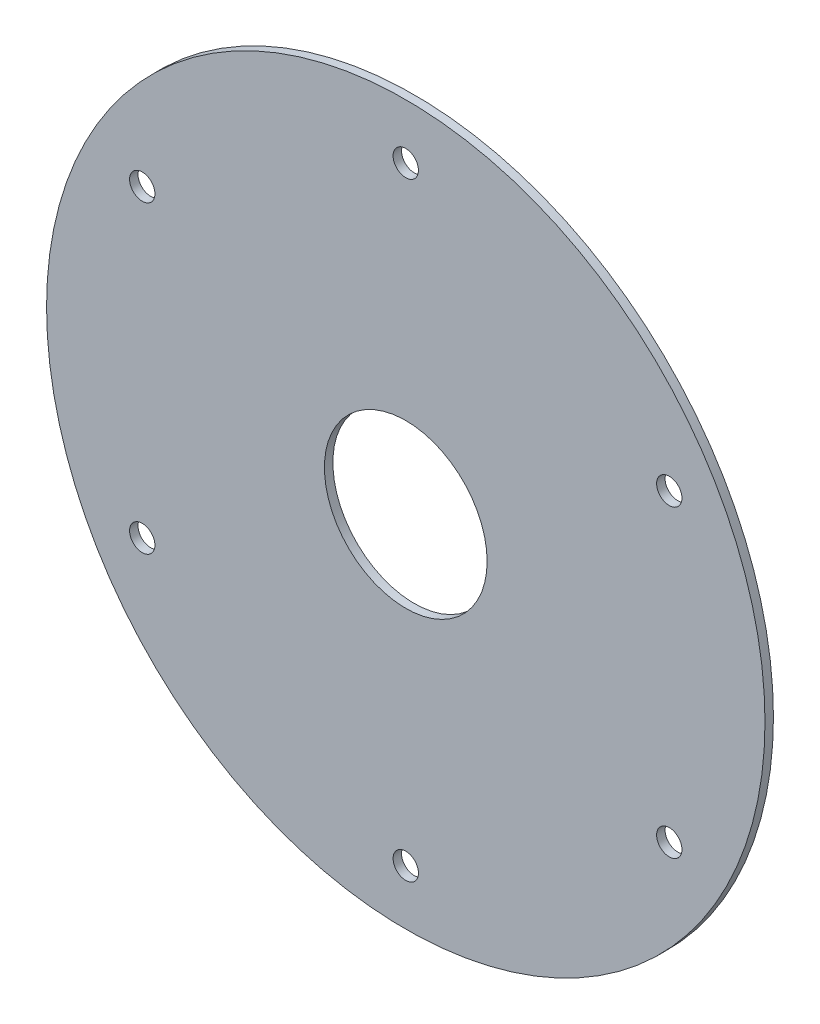
ISO-10303-21;
HEADER;
FILE_DESCRIPTION(('STEP AP214'),'2;1');
FILE_NAME('part.step','',(''),(''),'','','');
FILE_SCHEMA(('AUTOMOTIVE_DESIGN { 1 0 10303 214 1 1 1 1 }'));
ENDSEC;
DATA;
#1=APPLICATION_CONTEXT('core data for automotive mechanical design processes');
#2=APPLICATION_PROTOCOL_DEFINITION('international standard','automotive_design',2000,#1);
#3=PRODUCT_CONTEXT('',#1,'mechanical');
#4=PRODUCT('Part','Part','',(#3));
#5=PRODUCT_RELATED_PRODUCT_CATEGORY('part','',(#4));
#6=PRODUCT_DEFINITION_FORMATION('','',#4);
#7=PRODUCT_DEFINITION_CONTEXT('part definition',#1,'design');
#8=PRODUCT_DEFINITION('design','',#6,#7);
#9=PRODUCT_DEFINITION_SHAPE('','',#8);
#10=(LENGTH_UNIT() NAMED_UNIT(*) SI_UNIT(.MILLI.,.METRE.));
#11=(NAMED_UNIT(*) PLANE_ANGLE_UNIT() SI_UNIT($,.RADIAN.));
#12=(NAMED_UNIT(*) SI_UNIT($,.STERADIAN.) SOLID_ANGLE_UNIT());
#13=UNCERTAINTY_MEASURE_WITH_UNIT(LENGTH_MEASURE(1.E-05),#10,'distance_accuracy_value','');
#14=(GEOMETRIC_REPRESENTATION_CONTEXT(3) GLOBAL_UNCERTAINTY_ASSIGNED_CONTEXT((#13)) GLOBAL_UNIT_ASSIGNED_CONTEXT((#10,
#11,#12)) REPRESENTATION_CONTEXT('',''));
#15=CARTESIAN_POINT('',(0.,0.,0.));
#16=DIRECTION('',(0.,0.,1.));
#17=DIRECTION('',(1.,0.,0.));
#18=AXIS2_PLACEMENT_3D('',#15,#16,#17);
#19=CARTESIAN_POINT('',(0.,0.,4.));
#20=DIRECTION('',(0.,0.,1.));
#21=DIRECTION('',(1.,0.,0.));
#22=AXIS2_PLACEMENT_3D('',#19,#20,#21);
#23=PLANE('',#22);
#24=CARTESIAN_POINT('',(-124.707658144959,-72.0000000000001,4.));
#25=DIRECTION('',(0.,0.,1.));
#26=DIRECTION('',(1.,0.,0.));
#27=AXIS2_PLACEMENT_3D('',#24,#25,#26);
#28=CIRCLE('',#27,5.99999999999999);
#29=CARTESIAN_POINT('',(-118.707658144959,-72.0000000000001,4.));
#30=VERTEX_POINT('',#29);
#31=EDGE_CURVE('E75',#30,#30,#28,.T.);
#32=ORIENTED_EDGE('',*,*,#31,.F.);
#33=EDGE_LOOP('',(#32));
#34=FACE_BOUND('',#33,.T.);
#35=CARTESIAN_POINT('',(124.707658144959,-72.,4.));
#36=DIRECTION('',(0.,0.,1.));
#37=DIRECTION('',(1.,0.,0.));
#38=AXIS2_PLACEMENT_3D('',#35,#36,#37);
#39=CIRCLE('',#38,5.99999999999999);
#40=CARTESIAN_POINT('',(130.707658144959,-72.,4.));
#41=VERTEX_POINT('',#40);
#42=EDGE_CURVE('E63',#41,#41,#39,.T.);
#43=ORIENTED_EDGE('',*,*,#42,.F.);
#44=EDGE_LOOP('',(#43));
#45=FACE_BOUND('',#44,.T.);
#46=CARTESIAN_POINT('',(0.,144.,4.));
#47=DIRECTION('',(0.,0.,1.));
#48=DIRECTION('',(1.,0.,0.));
#49=AXIS2_PLACEMENT_3D('',#46,#47,#48);
#50=CIRCLE('',#49,6.);
#51=CARTESIAN_POINT('',(6.,144.,4.));
#52=VERTEX_POINT('',#51);
#53=EDGE_CURVE('E51',#52,#52,#50,.T.);
#54=ORIENTED_EDGE('',*,*,#53,.F.);
#55=EDGE_LOOP('',(#54));
#56=FACE_BOUND('',#55,.T.);
#57=CARTESIAN_POINT('',(0.,0.,4.));
#58=DIRECTION('',(0.,0.,1.));
#59=DIRECTION('',(1.,0.,0.));
#60=AXIS2_PLACEMENT_3D('',#57,#58,#59);
#61=CIRCLE('',#60,170.);
#62=CARTESIAN_POINT('',(170.,0.,4.));
#63=VERTEX_POINT('',#62);
#64=EDGE_CURVE('E10',#63,#63,#61,.T.);
#65=ORIENTED_EDGE('',*,*,#64,.T.);
#66=EDGE_LOOP('',(#65));
#67=FACE_BOUND('',#66,.T.);
#68=CARTESIAN_POINT('',(0.,0.,4.));
#69=DIRECTION('',(0.,0.,1.));
#70=DIRECTION('',(1.,0.,0.));
#71=AXIS2_PLACEMENT_3D('',#68,#69,#70);
#72=CIRCLE('',#71,38.5);
#73=CARTESIAN_POINT('',(38.5,0.,4.));
#74=VERTEX_POINT('',#73);
#75=EDGE_CURVE('E46',#74,#74,#72,.T.);
#76=ORIENTED_EDGE('',*,*,#75,.F.);
#77=EDGE_LOOP('',(#76));
#78=FACE_BOUND('',#77,.T.);
#79=CARTESIAN_POINT('',(124.707658144959,72.,4.));
#80=DIRECTION('',(0.,0.,1.));
#81=DIRECTION('',(1.,0.,0.));
#82=AXIS2_PLACEMENT_3D('',#79,#80,#81);
#83=CIRCLE('',#82,5.99999999999999);
#84=CARTESIAN_POINT('',(130.707658144959,72.,4.));
#85=VERTEX_POINT('',#84);
#86=EDGE_CURVE('E57',#85,#85,#83,.T.);
#87=ORIENTED_EDGE('',*,*,#86,.F.);
#88=EDGE_LOOP('',(#87));
#89=FACE_BOUND('',#88,.T.);
#90=CARTESIAN_POINT('',(0.,-144.,4.));
#91=DIRECTION('',(0.,0.,1.));
#92=DIRECTION('',(1.,0.,0.));
#93=AXIS2_PLACEMENT_3D('',#90,#91,#92);
#94=CIRCLE('',#93,6.);
#95=CARTESIAN_POINT('',(6.00000000000002,-144.,4.));
#96=VERTEX_POINT('',#95);
#97=EDGE_CURVE('E69',#96,#96,#94,.T.);
#98=ORIENTED_EDGE('',*,*,#97,.F.);
#99=EDGE_LOOP('',(#98));
#100=FACE_BOUND('',#99,.T.);
#101=CARTESIAN_POINT('',(-124.707658144959,71.9999999999999,4.));
#102=DIRECTION('',(0.,0.,1.));
#103=DIRECTION('',(1.,0.,0.));
#104=AXIS2_PLACEMENT_3D('',#101,#102,#103);
#105=CIRCLE('',#104,5.99999999999999);
#106=CARTESIAN_POINT('',(-118.707658144959,71.9999999999999,4.));
#107=VERTEX_POINT('',#106);
#108=EDGE_CURVE('E81',#107,#107,#105,.T.);
#109=ORIENTED_EDGE('',*,*,#108,.F.);
#110=EDGE_LOOP('',(#109));
#111=FACE_BOUND('',#110,.T.);
#112=ADVANCED_FACE('F35',(#34,#45,#56,#67,#78,#89,#100,#111),#23,.T.);
#113=CARTESIAN_POINT('',(0.,0.,0.));
#114=DIRECTION('',(0.,0.,1.));
#115=DIRECTION('',(1.,0.,0.));
#116=AXIS2_PLACEMENT_3D('',#113,#114,#115);
#117=PLANE('',#116);
#118=CARTESIAN_POINT('',(0.,0.,0.));
#119=DIRECTION('',(0.,0.,1.));
#120=DIRECTION('',(1.,0.,0.));
#121=AXIS2_PLACEMENT_3D('',#118,#119,#120);
#122=CIRCLE('',#121,170.);
#123=CARTESIAN_POINT('',(170.,0.,0.));
#124=VERTEX_POINT('',#123);
#125=EDGE_CURVE('E39',#124,#124,#122,.T.);
#126=ORIENTED_EDGE('',*,*,#125,.F.);
#127=EDGE_LOOP('',(#126));
#128=FACE_BOUND('',#127,.T.);
#129=CARTESIAN_POINT('',(0.,0.,0.));
#130=DIRECTION('',(0.,0.,1.));
#131=DIRECTION('',(1.,0.,0.));
#132=AXIS2_PLACEMENT_3D('',#129,#130,#131);
#133=CIRCLE('',#132,38.5);
#134=CARTESIAN_POINT('',(38.5,0.,0.));
#135=VERTEX_POINT('',#134);
#136=EDGE_CURVE('E48',#135,#135,#133,.T.);
#137=ORIENTED_EDGE('',*,*,#136,.T.);
#138=EDGE_LOOP('',(#137));
#139=FACE_BOUND('',#138,.T.);
#140=CARTESIAN_POINT('',(0.,144.,0.));
#141=DIRECTION('',(0.,0.,1.));
#142=DIRECTION('',(1.,0.,0.));
#143=AXIS2_PLACEMENT_3D('',#140,#141,#142);
#144=CIRCLE('',#143,6.);
#145=CARTESIAN_POINT('',(6.,144.,0.));
#146=VERTEX_POINT('',#145);
#147=EDGE_CURVE('E54',#146,#146,#144,.T.);
#148=ORIENTED_EDGE('',*,*,#147,.T.);
#149=EDGE_LOOP('',(#148));
#150=FACE_BOUND('',#149,.T.);
#151=CARTESIAN_POINT('',(124.707658144959,72.,0.));
#152=DIRECTION('',(0.,0.,1.));
#153=DIRECTION('',(1.,0.,0.));
#154=AXIS2_PLACEMENT_3D('',#151,#152,#153);
#155=CIRCLE('',#154,5.99999999999999);
#156=CARTESIAN_POINT('',(130.707658144959,72.,0.));
#157=VERTEX_POINT('',#156);
#158=EDGE_CURVE('E60',#157,#157,#155,.T.);
#159=ORIENTED_EDGE('',*,*,#158,.T.);
#160=EDGE_LOOP('',(#159));
#161=FACE_BOUND('',#160,.T.);
#162=CARTESIAN_POINT('',(124.707658144959,-72.,0.));
#163=DIRECTION('',(0.,0.,1.));
#164=DIRECTION('',(1.,0.,0.));
#165=AXIS2_PLACEMENT_3D('',#162,#163,#164);
#166=CIRCLE('',#165,5.99999999999999);
#167=CARTESIAN_POINT('',(130.707658144959,-72.,0.));
#168=VERTEX_POINT('',#167);
#169=EDGE_CURVE('E66',#168,#168,#166,.T.);
#170=ORIENTED_EDGE('',*,*,#169,.T.);
#171=EDGE_LOOP('',(#170));
#172=FACE_BOUND('',#171,.T.);
#173=CARTESIAN_POINT('',(0.,-144.,0.));
#174=DIRECTION('',(0.,0.,1.));
#175=DIRECTION('',(1.,0.,0.));
#176=AXIS2_PLACEMENT_3D('',#173,#174,#175);
#177=CIRCLE('',#176,6.);
#178=CARTESIAN_POINT('',(6.00000000000002,-144.,0.));
#179=VERTEX_POINT('',#178);
#180=EDGE_CURVE('E72',#179,#179,#177,.T.);
#181=ORIENTED_EDGE('',*,*,#180,.T.);
#182=EDGE_LOOP('',(#181));
#183=FACE_BOUND('',#182,.T.);
#184=CARTESIAN_POINT('',(-124.707658144959,-72.0000000000001,0.));
#185=DIRECTION('',(0.,0.,1.));
#186=DIRECTION('',(1.,0.,0.));
#187=AXIS2_PLACEMENT_3D('',#184,#185,#186);
#188=CIRCLE('',#187,5.99999999999999);
#189=CARTESIAN_POINT('',(-118.707658144959,-72.0000000000001,0.));
#190=VERTEX_POINT('',#189);
#191=EDGE_CURVE('E78',#190,#190,#188,.T.);
#192=ORIENTED_EDGE('',*,*,#191,.T.);
#193=EDGE_LOOP('',(#192));
#194=FACE_BOUND('',#193,.T.);
#195=CARTESIAN_POINT('',(-124.707658144959,71.9999999999999,0.));
#196=DIRECTION('',(0.,0.,1.));
#197=DIRECTION('',(1.,0.,0.));
#198=AXIS2_PLACEMENT_3D('',#195,#196,#197);
#199=CIRCLE('',#198,5.99999999999999);
#200=CARTESIAN_POINT('',(-118.707658144959,71.9999999999999,0.));
#201=VERTEX_POINT('',#200);
#202=EDGE_CURVE('E84',#201,#201,#199,.T.);
#203=ORIENTED_EDGE('',*,*,#202,.T.);
#204=EDGE_LOOP('',(#203));
#205=FACE_BOUND('',#204,.T.);
#206=ADVANCED_FACE('F94',(#128,#139,#150,#161,#172,#183,#194,#205),#117,.F.);
#207=CARTESIAN_POINT('',(0.,0.,4.));
#208=DIRECTION('',(0.,0.,-1.));
#209=DIRECTION('',(-1.,0.,0.));
#210=AXIS2_PLACEMENT_3D('',#207,#208,#209);
#211=CYLINDRICAL_SURFACE('',#210,170.);
#212=ORIENTED_EDGE('',*,*,#64,.F.);
#213=EDGE_LOOP('',(#212));
#214=FACE_BOUND('',#213,.T.);
#215=ORIENTED_EDGE('',*,*,#125,.T.);
#216=EDGE_LOOP('',(#215));
#217=FACE_BOUND('',#216,.T.);
#218=ADVANCED_FACE('F37',(#214,#217),#211,.T.);
#219=CARTESIAN_POINT('',(0.,0.,4.));
#220=DIRECTION('',(0.,0.,-1.));
#221=DIRECTION('',(-1.,0.,0.));
#222=AXIS2_PLACEMENT_3D('',#219,#220,#221);
#223=CYLINDRICAL_SURFACE('',#222,38.5);
#224=ORIENTED_EDGE('',*,*,#75,.T.);
#225=EDGE_LOOP('',(#224));
#226=FACE_BOUND('',#225,.T.);
#227=ORIENTED_EDGE('',*,*,#136,.F.);
#228=EDGE_LOOP('',(#227));
#229=FACE_BOUND('',#228,.T.);
#230=ADVANCED_FACE('F104',(#226,#229),#223,.F.);
#231=CARTESIAN_POINT('',(0.,144.,4.));
#232=DIRECTION('',(0.,0.,-1.));
#233=DIRECTION('',(-1.,0.,0.));
#234=AXIS2_PLACEMENT_3D('',#231,#232,#233);
#235=CYLINDRICAL_SURFACE('',#234,6.);
#236=ORIENTED_EDGE('',*,*,#53,.T.);
#237=EDGE_LOOP('',(#236));
#238=FACE_BOUND('',#237,.T.);
#239=ORIENTED_EDGE('',*,*,#147,.F.);
#240=EDGE_LOOP('',(#239));
#241=FACE_BOUND('',#240,.T.);
#242=ADVANCED_FACE('F107',(#238,#241),#235,.F.);
#243=CARTESIAN_POINT('',(124.707658144959,72.,4.));
#244=DIRECTION('',(0.,0.,-1.));
#245=DIRECTION('',(-1.,0.,0.));
#246=AXIS2_PLACEMENT_3D('',#243,#244,#245);
#247=CYLINDRICAL_SURFACE('',#246,5.99999999999999);
#248=ORIENTED_EDGE('',*,*,#86,.T.);
#249=EDGE_LOOP('',(#248));
#250=FACE_BOUND('',#249,.T.);
#251=ORIENTED_EDGE('',*,*,#158,.F.);
#252=EDGE_LOOP('',(#251));
#253=FACE_BOUND('',#252,.T.);
#254=ADVANCED_FACE('F111',(#250,#253),#247,.F.);
#255=CARTESIAN_POINT('',(124.707658144959,-72.,4.));
#256=DIRECTION('',(0.,0.,-1.));
#257=DIRECTION('',(-1.,0.,0.));
#258=AXIS2_PLACEMENT_3D('',#255,#256,#257);
#259=CYLINDRICAL_SURFACE('',#258,5.99999999999999);
#260=ORIENTED_EDGE('',*,*,#42,.T.);
#261=EDGE_LOOP('',(#260));
#262=FACE_BOUND('',#261,.T.);
#263=ORIENTED_EDGE('',*,*,#169,.F.);
#264=EDGE_LOOP('',(#263));
#265=FACE_BOUND('',#264,.T.);
#266=ADVANCED_FACE('F115',(#262,#265),#259,.F.);
#267=CARTESIAN_POINT('',(0.,-144.,4.));
#268=DIRECTION('',(0.,0.,-1.));
#269=DIRECTION('',(-1.,0.,0.));
#270=AXIS2_PLACEMENT_3D('',#267,#268,#269);
#271=CYLINDRICAL_SURFACE('',#270,6.);
#272=ORIENTED_EDGE('',*,*,#97,.T.);
#273=EDGE_LOOP('',(#272));
#274=FACE_BOUND('',#273,.T.);
#275=ORIENTED_EDGE('',*,*,#180,.F.);
#276=EDGE_LOOP('',(#275));
#277=FACE_BOUND('',#276,.T.);
#278=ADVANCED_FACE('F119',(#274,#277),#271,.F.);
#279=CARTESIAN_POINT('',(-124.707658144959,-72.0000000000001,4.));
#280=DIRECTION('',(0.,0.,-1.));
#281=DIRECTION('',(-1.,0.,0.));
#282=AXIS2_PLACEMENT_3D('',#279,#280,#281);
#283=CYLINDRICAL_SURFACE('',#282,5.99999999999999);
#284=ORIENTED_EDGE('',*,*,#31,.T.);
#285=EDGE_LOOP('',(#284));
#286=FACE_BOUND('',#285,.T.);
#287=ORIENTED_EDGE('',*,*,#191,.F.);
#288=EDGE_LOOP('',(#287));
#289=FACE_BOUND('',#288,.T.);
#290=ADVANCED_FACE('F123',(#286,#289),#283,.F.);
#291=CARTESIAN_POINT('',(-124.707658144959,71.9999999999999,4.));
#292=DIRECTION('',(0.,0.,-1.));
#293=DIRECTION('',(-1.,0.,0.));
#294=AXIS2_PLACEMENT_3D('',#291,#292,#293);
#295=CYLINDRICAL_SURFACE('',#294,5.99999999999999);
#296=ORIENTED_EDGE('',*,*,#108,.T.);
#297=EDGE_LOOP('',(#296));
#298=FACE_BOUND('',#297,.T.);
#299=ORIENTED_EDGE('',*,*,#202,.F.);
#300=EDGE_LOOP('',(#299));
#301=FACE_BOUND('',#300,.T.);
#302=ADVANCED_FACE('F90',(#298,#301),#295,.F.);
#303=CLOSED_SHELL('',(#112,#206,#218,#230,#242,#254,#266,#278,#290,#302));
#304=MANIFOLD_SOLID_BREP('B2',#303);
#305=ADVANCED_BREP_SHAPE_REPRESENTATION('',(#18,#304),#14);
#306=SHAPE_DEFINITION_REPRESENTATION(#9,#305);
ENDSEC;
END-ISO-10303-21;
